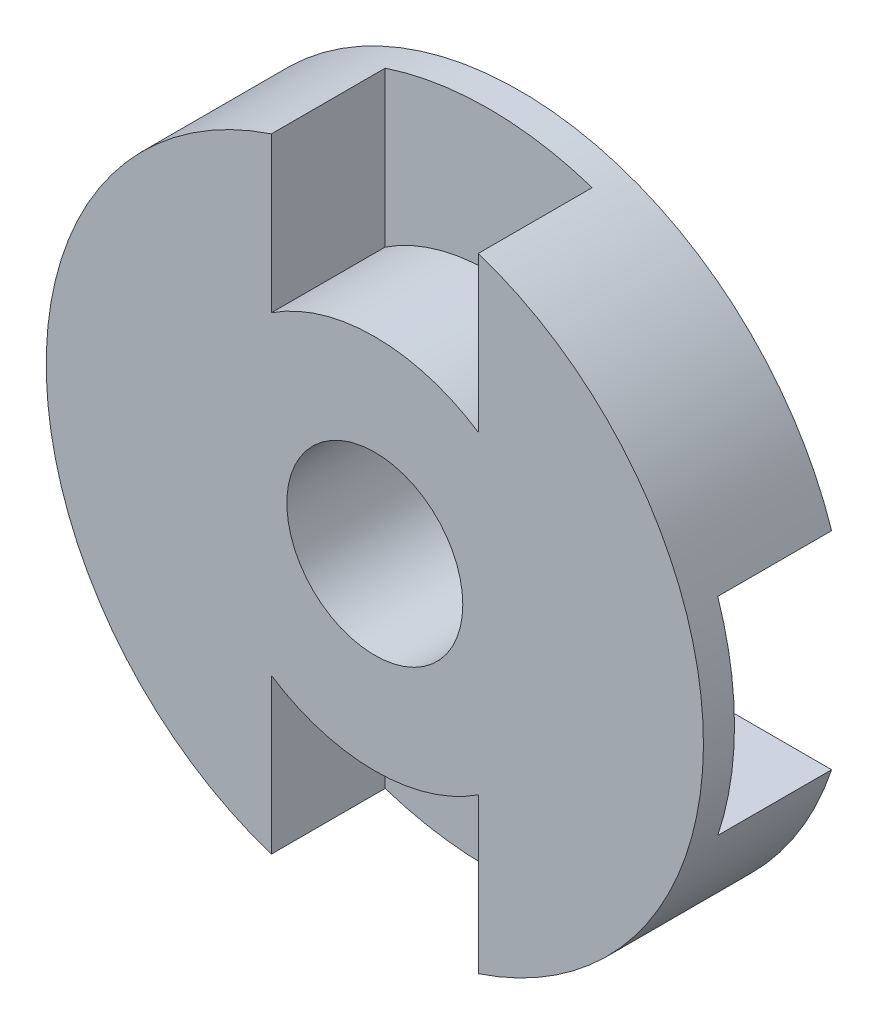
ISO-10303-21;
HEADER;
FILE_DESCRIPTION(('STEP AP214'),'2;1');
FILE_NAME('part.step','',(''),(''),'','','');
FILE_SCHEMA(('AUTOMOTIVE_DESIGN { 1 0 10303 214 1 1 1 1 }'));
ENDSEC;
DATA;
#1=APPLICATION_CONTEXT('core data for automotive mechanical design processes');
#2=APPLICATION_PROTOCOL_DEFINITION('international standard','automotive_design',2000,#1);
#3=PRODUCT_CONTEXT('',#1,'mechanical');
#4=PRODUCT('Part','Part','',(#3));
#5=PRODUCT_RELATED_PRODUCT_CATEGORY('part','',(#4));
#6=PRODUCT_DEFINITION_FORMATION('','',#4);
#7=PRODUCT_DEFINITION_CONTEXT('part definition',#1,'design');
#8=PRODUCT_DEFINITION('design','',#6,#7);
#9=PRODUCT_DEFINITION_SHAPE('','',#8);
#10=(LENGTH_UNIT() NAMED_UNIT(*) SI_UNIT(.MILLI.,.METRE.));
#11=(NAMED_UNIT(*) PLANE_ANGLE_UNIT() SI_UNIT($,.RADIAN.));
#12=(NAMED_UNIT(*) SI_UNIT($,.STERADIAN.) SOLID_ANGLE_UNIT());
#13=UNCERTAINTY_MEASURE_WITH_UNIT(LENGTH_MEASURE(1.E-05),#10,'distance_accuracy_value','');
#14=(GEOMETRIC_REPRESENTATION_CONTEXT(3) GLOBAL_UNCERTAINTY_ASSIGNED_CONTEXT((#13)) GLOBAL_UNIT_ASSIGNED_CONTEXT((#10,
#11,#12)) REPRESENTATION_CONTEXT('',''));
#15=CARTESIAN_POINT('',(0.,0.,0.));
#16=DIRECTION('',(0.,0.,1.));
#17=DIRECTION('',(1.,0.,0.));
#18=AXIS2_PLACEMENT_3D('',#15,#16,#17);
#19=CARTESIAN_POINT('',(-2.,6.35,-0.8));
#20=DIRECTION('',(-1.,0.,0.));
#21=DIRECTION('',(0.,0.,1.));
#22=AXIS2_PLACEMENT_3D('',#19,#20,#21);
#23=PLANE('',#22);
#24=DIRECTION('',(0.,0.,-1.));
#25=VECTOR('',#24,1.);
#26=CARTESIAN_POINT('',(-2.,3.03293405797093,11.6756757442029));
#27=LINE('',#26,#25);
#28=CARTESIAN_POINT('',(-2.,3.03293405797093,-0.8));
#29=VERTEX_POINT('',#28);
#30=CARTESIAN_POINT('',(-2.,3.03293405797093,1.4));
#31=VERTEX_POINT('',#30);
#32=EDGE_CURVE('E173',#29,#31,#27,.F.);
#33=ORIENTED_EDGE('',*,*,#32,.F.);
#34=DIRECTION('',(0.,-1.,0.));
#35=VECTOR('',#34,1.);
#36=CARTESIAN_POINT('',(-2.,6.35,-0.8));
#37=LINE('',#36,#35);
#38=CARTESIAN_POINT('',(-2.,6.02681507929354,-0.8));
#39=VERTEX_POINT('',#38);
#40=EDGE_CURVE('E235',#39,#29,#37,.T.);
#41=ORIENTED_EDGE('',*,*,#40,.F.);
#42=DIRECTION('',(0.,0.,1.));
#43=VECTOR('',#42,1.);
#44=CARTESIAN_POINT('',(-2.,6.02681507929354,-1.4));
#45=LINE('',#44,#43);
#46=CARTESIAN_POINT('',(-2.,6.02681507929354,1.4));
#47=VERTEX_POINT('',#46);
#48=EDGE_CURVE('E248',#39,#47,#45,.T.);
#49=ORIENTED_EDGE('',*,*,#48,.T.);
#50=DIRECTION('',(0.,-1.,0.));
#51=VECTOR('',#50,1.);
#52=CARTESIAN_POINT('',(-2.,0.,1.4));
#53=LINE('',#52,#51);
#54=EDGE_CURVE('E264',#47,#31,#53,.T.);
#55=ORIENTED_EDGE('',*,*,#54,.T.);
#56=EDGE_LOOP('',(#33,#41,#49,#55));
#57=FACE_BOUND('',#56,.T.);
#58=ADVANCED_FACE('F45',(#57),#23,.F.);
#59=DIRECTION('',(0.,0.,-1.));
#60=VECTOR('',#59,1.);
#61=CARTESIAN_POINT('',(-2.,-3.03293405797093,11.6756757442029));
#62=LINE('',#61,#60);
#63=CARTESIAN_POINT('',(-2.,-3.03293405797093,1.4));
#64=VERTEX_POINT('',#63);
#65=CARTESIAN_POINT('',(-2.,-3.03293405797093,-0.8));
#66=VERTEX_POINT('',#65);
#67=EDGE_CURVE('E60',#64,#66,#62,.T.);
#68=ORIENTED_EDGE('',*,*,#67,.F.);
#69=CARTESIAN_POINT('',(-2.,-6.02681507929354,1.4));
#70=VERTEX_POINT('',#69);
#71=EDGE_CURVE('E262',#64,#70,#53,.T.);
#72=ORIENTED_EDGE('',*,*,#71,.T.);
#73=DIRECTION('',(0.,0.,1.));
#74=VECTOR('',#73,1.);
#75=CARTESIAN_POINT('',(-2.,-6.02681507929354,-1.4));
#76=LINE('',#75,#74);
#77=CARTESIAN_POINT('',(-2.,-6.02681507929354,-0.8));
#78=VERTEX_POINT('',#77);
#79=EDGE_CURVE('E250',#70,#78,#76,.F.);
#80=ORIENTED_EDGE('',*,*,#79,.T.);
#81=EDGE_CURVE('E239',#66,#78,#37,.T.);
#82=ORIENTED_EDGE('',*,*,#81,.F.);
#83=EDGE_LOOP('',(#68,#72,#80,#82));
#84=FACE_BOUND('',#83,.T.);
#85=ADVANCED_FACE('F298',(#84),#23,.F.);
#86=CARTESIAN_POINT('',(2.,6.35,-0.8));
#87=DIRECTION('',(1.,0.,0.));
#88=DIRECTION('',(0.,1.,0.));
#89=AXIS2_PLACEMENT_3D('',#86,#87,#88);
#90=PLANE('',#89);
#91=DIRECTION('',(0.,0.,-1.));
#92=VECTOR('',#91,1.);
#93=CARTESIAN_POINT('',(2.,-3.03293405797093,11.6756757442029));
#94=LINE('',#93,#92);
#95=CARTESIAN_POINT('',(2.,-3.03293405797093,-0.8));
#96=VERTEX_POINT('',#95);
#97=CARTESIAN_POINT('',(2.,-3.03293405797093,1.4));
#98=VERTEX_POINT('',#97);
#99=EDGE_CURVE('E205',#96,#98,#94,.F.);
#100=ORIENTED_EDGE('',*,*,#99,.F.);
#101=DIRECTION('',(0.,1.,0.));
#102=VECTOR('',#101,1.);
#103=CARTESIAN_POINT('',(2.,6.35,-0.8));
#104=LINE('',#103,#102);
#105=CARTESIAN_POINT('',(2.,-6.02681507929354,-0.8));
#106=VERTEX_POINT('',#105);
#107=EDGE_CURVE('E240',#106,#96,#104,.T.);
#108=ORIENTED_EDGE('',*,*,#107,.F.);
#109=DIRECTION('',(0.,0.,1.));
#110=VECTOR('',#109,1.);
#111=CARTESIAN_POINT('',(2.,-6.02681507929354,-1.4));
#112=LINE('',#111,#110);
#113=CARTESIAN_POINT('',(2.,-6.02681507929354,1.4));
#114=VERTEX_POINT('',#113);
#115=EDGE_CURVE('E243',#106,#114,#112,.T.);
#116=ORIENTED_EDGE('',*,*,#115,.T.);
#117=DIRECTION('',(0.,1.,0.));
#118=VECTOR('',#117,1.);
#119=CARTESIAN_POINT('',(2.,0.,1.4));
#120=LINE('',#119,#118);
#121=EDGE_CURVE('E259',#114,#98,#120,.T.);
#122=ORIENTED_EDGE('',*,*,#121,.T.);
#123=EDGE_LOOP('',(#100,#108,#116,#122));
#124=FACE_BOUND('',#123,.T.);
#125=ADVANCED_FACE('F287',(#124),#90,.F.);
#126=DIRECTION('',(0.,0.,-1.));
#127=VECTOR('',#126,1.);
#128=CARTESIAN_POINT('',(2.,3.03293405797093,11.6756757442029));
#129=LINE('',#128,#127);
#130=CARTESIAN_POINT('',(2.,3.03293405797093,1.4));
#131=VERTEX_POINT('',#130);
#132=CARTESIAN_POINT('',(2.,3.03293405797093,-0.8));
#133=VERTEX_POINT('',#132);
#134=EDGE_CURVE('E208',#131,#133,#129,.T.);
#135=ORIENTED_EDGE('',*,*,#134,.F.);
#136=CARTESIAN_POINT('',(2.,6.02681507929354,1.4));
#137=VERTEX_POINT('',#136);
#138=EDGE_CURVE('E263',#131,#137,#120,.T.);
#139=ORIENTED_EDGE('',*,*,#138,.T.);
#140=DIRECTION('',(0.,0.,1.));
#141=VECTOR('',#140,1.);
#142=CARTESIAN_POINT('',(2.,6.02681507929354,-1.4));
#143=LINE('',#142,#141);
#144=CARTESIAN_POINT('',(2.,6.02681507929354,-0.8));
#145=VERTEX_POINT('',#144);
#146=EDGE_CURVE('E245',#137,#145,#143,.F.);
#147=ORIENTED_EDGE('',*,*,#146,.T.);
#148=EDGE_CURVE('E238',#133,#145,#104,.T.);
#149=ORIENTED_EDGE('',*,*,#148,.F.);
#150=EDGE_LOOP('',(#135,#139,#147,#149));
#151=FACE_BOUND('',#150,.T.);
#152=ADVANCED_FACE('F323',(#151),#90,.F.);
#153=CARTESIAN_POINT('',(6.35,2.,0.8));
#154=DIRECTION('',(0.,1.,0.));
#155=DIRECTION('',(0.,0.,1.));
#156=AXIS2_PLACEMENT_3D('',#153,#154,#155);
#157=PLANE('',#156);
#158=DIRECTION('',(0.,0.,-1.));
#159=VECTOR('',#158,1.);
#160=CARTESIAN_POINT('',(3.03293405797093,2.,11.6756757442029));
#161=LINE('',#160,#159);
#162=CARTESIAN_POINT('',(3.03293405797093,2.,-1.4));
#163=VERTEX_POINT('',#162);
#164=CARTESIAN_POINT('',(3.03293405797093,2.,0.8));
#165=VERTEX_POINT('',#164);
#166=EDGE_CURVE('E197',#163,#165,#161,.F.);
#167=ORIENTED_EDGE('',*,*,#166,.F.);
#168=DIRECTION('',(1.,0.,0.));
#169=VECTOR('',#168,1.);
#170=CARTESIAN_POINT('',(6.35,2.,-1.4));
#171=LINE('',#170,#169);
#172=CARTESIAN_POINT('',(6.02681507929354,2.,-1.4));
#173=VERTEX_POINT('',#172);
#174=EDGE_CURVE('E220',#163,#173,#171,.T.);
#175=ORIENTED_EDGE('',*,*,#174,.T.);
#176=DIRECTION('',(0.,0.,1.));
#177=VECTOR('',#176,1.);
#178=CARTESIAN_POINT('',(6.02681507929354,2.,-1.4));
#179=LINE('',#178,#177);
#180=CARTESIAN_POINT('',(6.02681507929354,2.,0.8));
#181=VERTEX_POINT('',#180);
#182=EDGE_CURVE('E226',#173,#181,#179,.T.);
#183=ORIENTED_EDGE('',*,*,#182,.T.);
#184=DIRECTION('',(1.,0.,0.));
#185=VECTOR('',#184,1.);
#186=CARTESIAN_POINT('',(6.35,2.,0.8));
#187=LINE('',#186,#185);
#188=EDGE_CURVE('E217',#165,#181,#187,.T.);
#189=ORIENTED_EDGE('',*,*,#188,.F.);
#190=EDGE_LOOP('',(#167,#175,#183,#189));
#191=FACE_BOUND('',#190,.T.);
#192=ADVANCED_FACE('F310',(#191),#157,.F.);
#193=DIRECTION('',(0.,0.,-1.));
#194=VECTOR('',#193,1.);
#195=CARTESIAN_POINT('',(-3.03293405797093,2.,11.6756757442029));
#196=LINE('',#195,#194);
#197=CARTESIAN_POINT('',(-3.03293405797093,2.,0.8));
#198=VERTEX_POINT('',#197);
#199=CARTESIAN_POINT('',(-3.03293405797093,2.,-1.4));
#200=VERTEX_POINT('',#199);
#201=EDGE_CURVE('E68',#198,#200,#196,.T.);
#202=ORIENTED_EDGE('',*,*,#201,.F.);
#203=CARTESIAN_POINT('',(-6.02681507929354,2.,0.8));
#204=VERTEX_POINT('',#203);
#205=EDGE_CURVE('E218',#204,#198,#187,.T.);
#206=ORIENTED_EDGE('',*,*,#205,.F.);
#207=DIRECTION('',(0.,0.,1.));
#208=VECTOR('',#207,1.);
#209=CARTESIAN_POINT('',(-6.02681507929354,2.,-1.4));
#210=LINE('',#209,#208);
#211=CARTESIAN_POINT('',(-6.02681507929354,2.,-1.4));
#212=VERTEX_POINT('',#211);
#213=EDGE_CURVE('E229',#204,#212,#210,.F.);
#214=ORIENTED_EDGE('',*,*,#213,.T.);
#215=EDGE_CURVE('E216',#212,#200,#171,.T.);
#216=ORIENTED_EDGE('',*,*,#215,.T.);
#217=EDGE_LOOP('',(#202,#206,#214,#216));
#218=FACE_BOUND('',#217,.T.);
#219=ADVANCED_FACE('F319',(#218),#157,.F.);
#220=CARTESIAN_POINT('',(6.35,-2.,0.8));
#221=DIRECTION('',(0.,-1.,0.));
#222=DIRECTION('',(0.,0.,-1.));
#223=AXIS2_PLACEMENT_3D('',#220,#221,#222);
#224=PLANE('',#223);
#225=DIRECTION('',(0.,0.,-1.));
#226=VECTOR('',#225,1.);
#227=CARTESIAN_POINT('',(-3.03293405797093,-2.,11.6756757442029));
#228=LINE('',#227,#226);
#229=CARTESIAN_POINT('',(-3.03293405797093,-2.,-1.4));
#230=VERTEX_POINT('',#229);
#231=CARTESIAN_POINT('',(-3.03293405797093,-2.,0.8));
#232=VERTEX_POINT('',#231);
#233=EDGE_CURVE('E11',#230,#232,#228,.F.);
#234=ORIENTED_EDGE('',*,*,#233,.F.);
#235=DIRECTION('',(-1.,0.,0.));
#236=VECTOR('',#235,1.);
#237=CARTESIAN_POINT('',(6.35,-2.,-1.4));
#238=LINE('',#237,#236);
#239=CARTESIAN_POINT('',(-6.02681507929354,-2.,-1.4));
#240=VERTEX_POINT('',#239);
#241=EDGE_CURVE('E159',#230,#240,#238,.T.);
#242=ORIENTED_EDGE('',*,*,#241,.T.);
#243=DIRECTION('',(0.,0.,1.));
#244=VECTOR('',#243,1.);
#245=CARTESIAN_POINT('',(-6.02681507929354,-2.,-1.4));
#246=LINE('',#245,#244);
#247=CARTESIAN_POINT('',(-6.02681507929354,-2.,0.8));
#248=VERTEX_POINT('',#247);
#249=EDGE_CURVE('E222',#240,#248,#246,.T.);
#250=ORIENTED_EDGE('',*,*,#249,.T.);
#251=DIRECTION('',(-1.,0.,0.));
#252=VECTOR('',#251,1.);
#253=CARTESIAN_POINT('',(6.35,-2.,0.8));
#254=LINE('',#253,#252);
#255=EDGE_CURVE('E177',#232,#248,#254,.T.);
#256=ORIENTED_EDGE('',*,*,#255,.F.);
#257=EDGE_LOOP('',(#234,#242,#250,#256));
#258=FACE_BOUND('',#257,.T.);
#259=ADVANCED_FACE('F176',(#258),#224,.F.);
#260=DIRECTION('',(0.,0.,-1.));
#261=VECTOR('',#260,1.);
#262=CARTESIAN_POINT('',(3.03293405797093,-2.,11.6756757442029));
#263=LINE('',#262,#261);
#264=CARTESIAN_POINT('',(3.03293405797093,-2.,0.8));
#265=VERTEX_POINT('',#264);
#266=CARTESIAN_POINT('',(3.03293405797093,-2.,-1.4));
#267=VERTEX_POINT('',#266);
#268=EDGE_CURVE('E53',#265,#267,#263,.T.);
#269=ORIENTED_EDGE('',*,*,#268,.F.);
#270=CARTESIAN_POINT('',(6.02681507929354,-2.,0.8));
#271=VERTEX_POINT('',#270);
#272=EDGE_CURVE('E215',#271,#265,#254,.T.);
#273=ORIENTED_EDGE('',*,*,#272,.F.);
#274=DIRECTION('',(0.,0.,1.));
#275=VECTOR('',#274,1.);
#276=CARTESIAN_POINT('',(6.02681507929354,-2.,-1.4));
#277=LINE('',#276,#275);
#278=CARTESIAN_POINT('',(6.02681507929354,-2.,-1.4));
#279=VERTEX_POINT('',#278);
#280=EDGE_CURVE('E224',#271,#279,#277,.F.);
#281=ORIENTED_EDGE('',*,*,#280,.T.);
#282=EDGE_CURVE('E172',#279,#267,#238,.T.);
#283=ORIENTED_EDGE('',*,*,#282,.T.);
#284=EDGE_LOOP('',(#269,#273,#281,#283));
#285=FACE_BOUND('',#284,.T.);
#286=ADVANCED_FACE('F315',(#285),#224,.F.);
#287=CARTESIAN_POINT('',(-2.,-6.35,-0.8));
#288=DIRECTION('',(0.,0.,1.));
#289=DIRECTION('',(1.,0.,0.));
#290=AXIS2_PLACEMENT_3D('',#287,#288,#289);
#291=PLANE('',#290);
#292=ORIENTED_EDGE('',*,*,#40,.T.);
#293=CARTESIAN_POINT('',(0.,0.,-0.8));
#294=DIRECTION('',(0.,0.,1.));
#295=DIRECTION('',(1.,0.,0.));
#296=AXIS2_PLACEMENT_3D('',#293,#294,#295);
#297=CIRCLE('',#296,3.633);
#298=EDGE_CURVE('E210',#29,#133,#297,.F.);
#299=ORIENTED_EDGE('',*,*,#298,.T.);
#300=ORIENTED_EDGE('',*,*,#148,.T.);
#301=CARTESIAN_POINT('',(0.,0.,-0.8));
#302=DIRECTION('',(0.,0.,1.));
#303=DIRECTION('',(1.,0.,0.));
#304=AXIS2_PLACEMENT_3D('',#301,#302,#303);
#305=CIRCLE('',#304,6.35);
#306=EDGE_CURVE('E267',#39,#145,#305,.F.);
#307=ORIENTED_EDGE('',*,*,#306,.F.);
#308=EDGE_LOOP('',(#292,#299,#300,#307));
#309=FACE_BOUND('',#308,.T.);
#310=ADVANCED_FACE('F328',(#309),#291,.T.);
#311=CARTESIAN_POINT('',(0.,0.,-1.4));
#312=DIRECTION('',(0.,0.,1.));
#313=DIRECTION('',(1.,0.,0.));
#314=AXIS2_PLACEMENT_3D('',#311,#312,#313);
#315=CYLINDRICAL_SURFACE('',#314,6.35);
#316=ORIENTED_EDGE('',*,*,#182,.F.);
#317=CARTESIAN_POINT('',(0.,0.,-1.4));
#318=DIRECTION('',(0.,0.,1.));
#319=DIRECTION('',(1.,0.,0.));
#320=AXIS2_PLACEMENT_3D('',#317,#318,#319);
#321=CIRCLE('',#320,6.35);
#322=EDGE_CURVE('E255',#173,#212,#321,.T.);
#323=ORIENTED_EDGE('',*,*,#322,.T.);
#324=ORIENTED_EDGE('',*,*,#213,.F.);
#325=CARTESIAN_POINT('',(0.,0.,0.8));
#326=DIRECTION('',(0.,0.,-1.));
#327=DIRECTION('',(-1.,0.,0.));
#328=AXIS2_PLACEMENT_3D('',#325,#326,#327);
#329=CIRCLE('',#328,6.35);
#330=EDGE_CURVE('E231',#204,#248,#329,.F.);
#331=ORIENTED_EDGE('',*,*,#330,.T.);
#332=ORIENTED_EDGE('',*,*,#249,.F.);
#333=EDGE_CURVE('E168',#240,#279,#321,.T.);
#334=ORIENTED_EDGE('',*,*,#333,.T.);
#335=ORIENTED_EDGE('',*,*,#280,.F.);
#336=EDGE_CURVE('E234',#271,#181,#329,.F.);
#337=ORIENTED_EDGE('',*,*,#336,.T.);
#338=EDGE_LOOP('',(#316,#323,#324,#331,#332,#334,#335,#337));
#339=FACE_BOUND('',#338,.T.);
#340=ORIENTED_EDGE('',*,*,#79,.F.);
#341=CARTESIAN_POINT('',(0.,0.,1.4));
#342=DIRECTION('',(0.,0.,1.));
#343=DIRECTION('',(1.,0.,0.));
#344=AXIS2_PLACEMENT_3D('',#341,#342,#343);
#345=CIRCLE('',#344,6.35);
#346=EDGE_CURVE('E256',#47,#70,#345,.T.);
#347=ORIENTED_EDGE('',*,*,#346,.F.);
#348=ORIENTED_EDGE('',*,*,#48,.F.);
#349=ORIENTED_EDGE('',*,*,#306,.T.);
#350=ORIENTED_EDGE('',*,*,#146,.F.);
#351=EDGE_CURVE('E253',#114,#137,#345,.T.);
#352=ORIENTED_EDGE('',*,*,#351,.F.);
#353=ORIENTED_EDGE('',*,*,#115,.F.);
#354=EDGE_CURVE('E269',#106,#78,#305,.F.);
#355=ORIENTED_EDGE('',*,*,#354,.T.);
#356=EDGE_LOOP('',(#340,#347,#348,#349,#350,#352,#353,#355));
#357=FACE_BOUND('',#356,.T.);
#358=ADVANCED_FACE('F47',(#339,#357),#315,.T.);
#359=CARTESIAN_POINT('',(0.,0.,-1.4));
#360=DIRECTION('',(0.,0.,1.));
#361=DIRECTION('',(1.,0.,0.));
#362=AXIS2_PLACEMENT_3D('',#359,#360,#361);
#363=PLANE('',#362);
#364=ORIENTED_EDGE('',*,*,#241,.F.);
#365=CARTESIAN_POINT('',(0.,0.,-1.4));
#366=DIRECTION('',(0.,0.,1.));
#367=DIRECTION('',(1.,0.,0.));
#368=AXIS2_PLACEMENT_3D('',#365,#366,#367);
#369=CIRCLE('',#368,3.633);
#370=EDGE_CURVE('E165',#230,#200,#369,.F.);
#371=ORIENTED_EDGE('',*,*,#370,.T.);
#372=ORIENTED_EDGE('',*,*,#215,.F.);
#373=ORIENTED_EDGE('',*,*,#322,.F.);
#374=ORIENTED_EDGE('',*,*,#174,.F.);
#375=EDGE_CURVE('E182',#163,#267,#369,.F.);
#376=ORIENTED_EDGE('',*,*,#375,.T.);
#377=ORIENTED_EDGE('',*,*,#282,.F.);
#378=ORIENTED_EDGE('',*,*,#333,.F.);
#379=EDGE_LOOP('',(#364,#371,#372,#373,#374,#376,#377,#378));
#380=FACE_BOUND('',#379,.T.);
#381=CARTESIAN_POINT('',(0.,0.,-1.4));
#382=DIRECTION('',(0.,0.,1.));
#383=DIRECTION('',(1.,0.,0.));
#384=AXIS2_PLACEMENT_3D('',#381,#382,#383);
#385=CIRCLE('',#384,1.7);
#386=CARTESIAN_POINT('',(1.7,0.,-1.4));
#387=VERTEX_POINT('',#386);
#388=EDGE_CURVE('E188',#387,#387,#385,.F.);
#389=ORIENTED_EDGE('',*,*,#388,.F.);
#390=EDGE_LOOP('',(#389));
#391=FACE_BOUND('',#390,.T.);
#392=ADVANCED_FACE('F161',(#380,#391),#363,.F.);
#393=CARTESIAN_POINT('',(0.,0.,1.4));
#394=DIRECTION('',(0.,0.,1.));
#395=DIRECTION('',(1.,0.,0.));
#396=AXIS2_PLACEMENT_3D('',#393,#394,#395);
#397=PLANE('',#396);
#398=ORIENTED_EDGE('',*,*,#138,.F.);
#399=CARTESIAN_POINT('',(0.,0.,1.4));
#400=DIRECTION('',(0.,0.,1.));
#401=DIRECTION('',(1.,0.,0.));
#402=AXIS2_PLACEMENT_3D('',#399,#400,#401);
#403=CIRCLE('',#402,3.633);
#404=EDGE_CURVE('E192',#131,#31,#403,.T.);
#405=ORIENTED_EDGE('',*,*,#404,.T.);
#406=ORIENTED_EDGE('',*,*,#54,.F.);
#407=ORIENTED_EDGE('',*,*,#346,.T.);
#408=ORIENTED_EDGE('',*,*,#71,.F.);
#409=EDGE_CURVE('E185',#64,#98,#403,.T.);
#410=ORIENTED_EDGE('',*,*,#409,.T.);
#411=ORIENTED_EDGE('',*,*,#121,.F.);
#412=ORIENTED_EDGE('',*,*,#351,.T.);
#413=EDGE_LOOP('',(#398,#405,#406,#407,#408,#410,#411,#412));
#414=FACE_BOUND('',#413,.T.);
#415=CARTESIAN_POINT('',(0.,0.,1.4));
#416=DIRECTION('',(0.,0.,1.));
#417=DIRECTION('',(1.,0.,0.));
#418=AXIS2_PLACEMENT_3D('',#415,#416,#417);
#419=CIRCLE('',#418,1.7);
#420=CARTESIAN_POINT('',(1.7,0.,1.4));
#421=VERTEX_POINT('',#420);
#422=EDGE_CURVE('E181',#421,#421,#419,.T.);
#423=ORIENTED_EDGE('',*,*,#422,.F.);
#424=EDGE_LOOP('',(#423));
#425=FACE_BOUND('',#424,.T.);
#426=ADVANCED_FACE('F294',(#414,#425),#397,.T.);
#427=ORIENTED_EDGE('',*,*,#107,.T.);
#428=CARTESIAN_POINT('',(0.,0.,-0.8));
#429=DIRECTION('',(0.,0.,1.));
#430=DIRECTION('',(1.,0.,0.));
#431=AXIS2_PLACEMENT_3D('',#428,#429,#430);
#432=CIRCLE('',#431,3.633);
#433=EDGE_CURVE('E203',#96,#66,#432,.F.);
#434=ORIENTED_EDGE('',*,*,#433,.T.);
#435=ORIENTED_EDGE('',*,*,#81,.T.);
#436=ORIENTED_EDGE('',*,*,#354,.F.);
#437=EDGE_LOOP('',(#427,#434,#435,#436));
#438=FACE_BOUND('',#437,.T.);
#439=ADVANCED_FACE('F283',(#438),#291,.T.);
#440=CARTESIAN_POINT('',(6.35,-2.,0.8));
#441=DIRECTION('',(0.,0.,-1.));
#442=DIRECTION('',(-1.,0.,0.));
#443=AXIS2_PLACEMENT_3D('',#440,#441,#442);
#444=PLANE('',#443);
#445=ORIENTED_EDGE('',*,*,#205,.T.);
#446=CARTESIAN_POINT('',(0.,0.,0.8));
#447=DIRECTION('',(0.,0.,-1.));
#448=DIRECTION('',(-1.,0.,0.));
#449=AXIS2_PLACEMENT_3D('',#446,#447,#448);
#450=CIRCLE('',#449,3.633);
#451=EDGE_CURVE('E200',#198,#232,#450,.F.);
#452=ORIENTED_EDGE('',*,*,#451,.T.);
#453=ORIENTED_EDGE('',*,*,#255,.T.);
#454=ORIENTED_EDGE('',*,*,#330,.F.);
#455=EDGE_LOOP('',(#445,#452,#453,#454));
#456=FACE_BOUND('',#455,.T.);
#457=ADVANCED_FACE('F318',(#456),#444,.T.);
#458=ORIENTED_EDGE('',*,*,#272,.T.);
#459=CARTESIAN_POINT('',(0.,0.,0.8));
#460=DIRECTION('',(0.,0.,-1.));
#461=DIRECTION('',(-1.,0.,0.));
#462=AXIS2_PLACEMENT_3D('',#459,#460,#461);
#463=CIRCLE('',#462,3.633);
#464=EDGE_CURVE('E194',#265,#165,#463,.F.);
#465=ORIENTED_EDGE('',*,*,#464,.T.);
#466=ORIENTED_EDGE('',*,*,#188,.T.);
#467=ORIENTED_EDGE('',*,*,#336,.F.);
#468=EDGE_LOOP('',(#458,#465,#466,#467));
#469=FACE_BOUND('',#468,.T.);
#470=ADVANCED_FACE('F313',(#469),#444,.T.);
#471=CARTESIAN_POINT('',(0.,0.,11.6756757442029));
#472=DIRECTION('',(0.,0.,-1.));
#473=DIRECTION('',(-1.,0.,0.));
#474=AXIS2_PLACEMENT_3D('',#471,#472,#473);
#475=CYLINDRICAL_SURFACE('',#474,3.633);
#476=ORIENTED_EDGE('',*,*,#298,.F.);
#477=ORIENTED_EDGE('',*,*,#32,.T.);
#478=ORIENTED_EDGE('',*,*,#404,.F.);
#479=ORIENTED_EDGE('',*,*,#134,.T.);
#480=EDGE_LOOP('',(#476,#477,#478,#479));
#481=FACE_BOUND('',#480,.T.);
#482=ADVANCED_FACE('F332',(#481),#475,.T.);
#483=ORIENTED_EDGE('',*,*,#409,.F.);
#484=ORIENTED_EDGE('',*,*,#67,.T.);
#485=ORIENTED_EDGE('',*,*,#433,.F.);
#486=ORIENTED_EDGE('',*,*,#99,.T.);
#487=EDGE_LOOP('',(#483,#484,#485,#486));
#488=FACE_BOUND('',#487,.T.);
#489=ADVANCED_FACE('F290',(#488),#475,.T.);
#490=ORIENTED_EDGE('',*,*,#451,.F.);
#491=ORIENTED_EDGE('',*,*,#201,.T.);
#492=ORIENTED_EDGE('',*,*,#370,.F.);
#493=ORIENTED_EDGE('',*,*,#233,.T.);
#494=EDGE_LOOP('',(#490,#491,#492,#493));
#495=FACE_BOUND('',#494,.T.);
#496=ADVANCED_FACE('F180',(#495),#475,.T.);
#497=ORIENTED_EDGE('',*,*,#375,.F.);
#498=ORIENTED_EDGE('',*,*,#166,.T.);
#499=ORIENTED_EDGE('',*,*,#464,.F.);
#500=ORIENTED_EDGE('',*,*,#268,.T.);
#501=EDGE_LOOP('',(#497,#498,#499,#500));
#502=FACE_BOUND('',#501,.T.);
#503=ADVANCED_FACE('F312',(#502),#475,.T.);
#504=CARTESIAN_POINT('',(0.,0.,11.6756757442029));
#505=DIRECTION('',(0.,0.,-1.));
#506=DIRECTION('',(-1.,0.,0.));
#507=AXIS2_PLACEMENT_3D('',#504,#505,#506);
#508=CYLINDRICAL_SURFACE('',#507,1.7);
#509=ORIENTED_EDGE('',*,*,#422,.T.);
#510=EDGE_LOOP('',(#509));
#511=FACE_BOUND('',#510,.T.);
#512=ORIENTED_EDGE('',*,*,#388,.T.);
#513=EDGE_LOOP('',(#512));
#514=FACE_BOUND('',#513,.T.);
#515=ADVANCED_FACE('F342',(#511,#514),#508,.F.);
#516=CLOSED_SHELL('',(#58,#85,#125,#152,#192,#219,#259,#286,#310,#358,#392,#426,#439,#457,#470,
#482,#489,#496,#503,#515));
#517=MANIFOLD_SOLID_BREP('B2',#516);
#518=ADVANCED_BREP_SHAPE_REPRESENTATION('',(#18,#517),#14);
#519=SHAPE_DEFINITION_REPRESENTATION(#9,#518);
ENDSEC;
END-ISO-10303-21;
